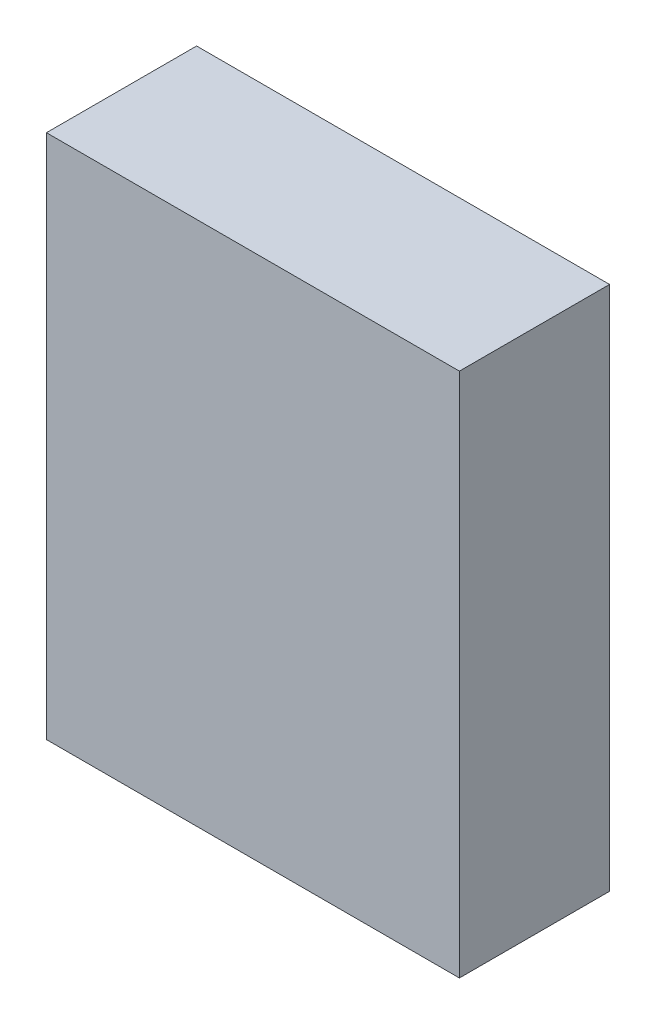
ISO-10303-21;
HEADER;
FILE_DESCRIPTION(('STEP AP214'),'2;1');
FILE_NAME('part.step','',(''),(''),'','','');
FILE_SCHEMA(('AUTOMOTIVE_DESIGN { 1 0 10303 214 1 1 1 1 }'));
ENDSEC;
DATA;
#1=APPLICATION_CONTEXT('core data for automotive mechanical design processes');
#2=APPLICATION_PROTOCOL_DEFINITION('international standard','automotive_design',2000,#1);
#3=PRODUCT_CONTEXT('',#1,'mechanical');
#4=PRODUCT('Part','Part','',(#3));
#5=PRODUCT_RELATED_PRODUCT_CATEGORY('part','',(#4));
#6=PRODUCT_DEFINITION_FORMATION('','',#4);
#7=PRODUCT_DEFINITION_CONTEXT('part definition',#1,'design');
#8=PRODUCT_DEFINITION('design','',#6,#7);
#9=PRODUCT_DEFINITION_SHAPE('','',#8);
#10=(LENGTH_UNIT() NAMED_UNIT(*) SI_UNIT(.MILLI.,.METRE.));
#11=(NAMED_UNIT(*) PLANE_ANGLE_UNIT() SI_UNIT($,.RADIAN.));
#12=(NAMED_UNIT(*) SI_UNIT($,.STERADIAN.) SOLID_ANGLE_UNIT());
#13=UNCERTAINTY_MEASURE_WITH_UNIT(LENGTH_MEASURE(1.E-05),#10,'distance_accuracy_value','');
#14=(GEOMETRIC_REPRESENTATION_CONTEXT(3) GLOBAL_UNCERTAINTY_ASSIGNED_CONTEXT((#13)) GLOBAL_UNIT_ASSIGNED_CONTEXT((#10,
#11,#12)) REPRESENTATION_CONTEXT('',''));
#15=CARTESIAN_POINT('',(0.,0.,0.));
#16=DIRECTION('',(0.,0.,1.));
#17=DIRECTION('',(1.,0.,0.));
#18=AXIS2_PLACEMENT_3D('',#15,#16,#17);
#19=CARTESIAN_POINT('',(-27.5,35.,20.));
#20=DIRECTION('',(1.,0.,0.));
#21=DIRECTION('',(0.,0.,-1.));
#22=AXIS2_PLACEMENT_3D('',#19,#20,#21);
#23=PLANE('',#22);
#24=DIRECTION('',(0.,-1.,0.));
#25=VECTOR('',#24,1.);
#26=CARTESIAN_POINT('',(-27.5,35.,0.));
#27=LINE('',#26,#25);
#28=CARTESIAN_POINT('',(-27.5,35.,0.));
#29=VERTEX_POINT('',#28);
#30=CARTESIAN_POINT('',(-27.5,-35.,0.));
#31=VERTEX_POINT('',#30);
#32=EDGE_CURVE('E96',#29,#31,#27,.T.);
#33=ORIENTED_EDGE('',*,*,#32,.T.);
#34=DIRECTION('',(0.,0.,-1.));
#35=VECTOR('',#34,1.);
#36=CARTESIAN_POINT('',(-27.5,-35.,20.));
#37=LINE('',#36,#35);
#38=CARTESIAN_POINT('',(-27.5,-35.,20.));
#39=VERTEX_POINT('',#38);
#40=EDGE_CURVE('E11',#39,#31,#37,.T.);
#41=ORIENTED_EDGE('',*,*,#40,.F.);
#42=DIRECTION('',(0.,-1.,0.));
#43=VECTOR('',#42,1.);
#44=CARTESIAN_POINT('',(-27.5,35.,20.));
#45=LINE('',#44,#43);
#46=CARTESIAN_POINT('',(-27.5,35.,20.));
#47=VERTEX_POINT('',#46);
#48=EDGE_CURVE('E84',#47,#39,#45,.T.);
#49=ORIENTED_EDGE('',*,*,#48,.F.);
#50=DIRECTION('',(0.,0.,-1.));
#51=VECTOR('',#50,1.);
#52=CARTESIAN_POINT('',(-27.5,35.,20.));
#53=LINE('',#52,#51);
#54=EDGE_CURVE('E92',#47,#29,#53,.T.);
#55=ORIENTED_EDGE('',*,*,#54,.T.);
#56=EDGE_LOOP('',(#33,#41,#49,#55));
#57=FACE_BOUND('',#56,.T.);
#58=ADVANCED_FACE('F33',(#57),#23,.F.);
#59=CARTESIAN_POINT('',(27.5,-35.,20.));
#60=DIRECTION('',(0.,1.,0.));
#61=DIRECTION('',(0.,0.,1.));
#62=AXIS2_PLACEMENT_3D('',#59,#60,#61);
#63=PLANE('',#62);
#64=DIRECTION('',(1.,0.,0.));
#65=VECTOR('',#64,1.);
#66=CARTESIAN_POINT('',(27.5,-35.,0.));
#67=LINE('',#66,#65);
#68=CARTESIAN_POINT('',(27.5,-35.,0.));
#69=VERTEX_POINT('',#68);
#70=EDGE_CURVE('E88',#31,#69,#67,.T.);
#71=ORIENTED_EDGE('',*,*,#70,.T.);
#72=DIRECTION('',(0.,0.,-1.));
#73=VECTOR('',#72,1.);
#74=CARTESIAN_POINT('',(27.5,-35.,20.));
#75=LINE('',#74,#73);
#76=CARTESIAN_POINT('',(27.5,-35.,20.));
#77=VERTEX_POINT('',#76);
#78=EDGE_CURVE('E41',#77,#69,#75,.T.);
#79=ORIENTED_EDGE('',*,*,#78,.F.);
#80=DIRECTION('',(1.,0.,0.));
#81=VECTOR('',#80,1.);
#82=CARTESIAN_POINT('',(27.5,-35.,20.));
#83=LINE('',#82,#81);
#84=EDGE_CURVE('E79',#39,#77,#83,.T.);
#85=ORIENTED_EDGE('',*,*,#84,.F.);
#86=ORIENTED_EDGE('',*,*,#40,.T.);
#87=EDGE_LOOP('',(#71,#79,#85,#86));
#88=FACE_BOUND('',#87,.T.);
#89=ADVANCED_FACE('F87',(#88),#63,.F.);
#90=CARTESIAN_POINT('',(27.5,35.,20.));
#91=DIRECTION('',(-1.,0.,0.));
#92=DIRECTION('',(0.,0.,1.));
#93=AXIS2_PLACEMENT_3D('',#90,#91,#92);
#94=PLANE('',#93);
#95=DIRECTION('',(0.,1.,0.));
#96=VECTOR('',#95,1.);
#97=CARTESIAN_POINT('',(27.5,35.,0.));
#98=LINE('',#97,#96);
#99=CARTESIAN_POINT('',(27.5,35.,0.));
#100=VERTEX_POINT('',#99);
#101=EDGE_CURVE('E66',#69,#100,#98,.T.);
#102=ORIENTED_EDGE('',*,*,#101,.T.);
#103=DIRECTION('',(0.,0.,-1.));
#104=VECTOR('',#103,1.);
#105=CARTESIAN_POINT('',(27.5,35.,20.));
#106=LINE('',#105,#104);
#107=CARTESIAN_POINT('',(27.5,35.,20.));
#108=VERTEX_POINT('',#107);
#109=EDGE_CURVE('E89',#108,#100,#106,.T.);
#110=ORIENTED_EDGE('',*,*,#109,.F.);
#111=DIRECTION('',(0.,1.,0.));
#112=VECTOR('',#111,1.);
#113=CARTESIAN_POINT('',(27.5,35.,20.));
#114=LINE('',#113,#112);
#115=EDGE_CURVE('E82',#77,#108,#114,.T.);
#116=ORIENTED_EDGE('',*,*,#115,.F.);
#117=ORIENTED_EDGE('',*,*,#78,.T.);
#118=EDGE_LOOP('',(#102,#110,#116,#117));
#119=FACE_BOUND('',#118,.T.);
#120=ADVANCED_FACE('F90',(#119),#94,.F.);
#121=CARTESIAN_POINT('',(27.5,35.,20.));
#122=DIRECTION('',(0.,-1.,0.));
#123=DIRECTION('',(0.,0.,-1.));
#124=AXIS2_PLACEMENT_3D('',#121,#122,#123);
#125=PLANE('',#124);
#126=DIRECTION('',(-1.,0.,0.));
#127=VECTOR('',#126,1.);
#128=CARTESIAN_POINT('',(27.5,35.,0.));
#129=LINE('',#128,#127);
#130=EDGE_CURVE('E72',#100,#29,#129,.T.);
#131=ORIENTED_EDGE('',*,*,#130,.T.);
#132=ORIENTED_EDGE('',*,*,#54,.F.);
#133=DIRECTION('',(-1.,0.,0.));
#134=VECTOR('',#133,1.);
#135=CARTESIAN_POINT('',(27.5,35.,20.));
#136=LINE('',#135,#134);
#137=EDGE_CURVE('E49',#108,#47,#136,.T.);
#138=ORIENTED_EDGE('',*,*,#137,.F.);
#139=ORIENTED_EDGE('',*,*,#109,.T.);
#140=EDGE_LOOP('',(#131,#132,#138,#139));
#141=FACE_BOUND('',#140,.T.);
#142=ADVANCED_FACE('F103',(#141),#125,.F.);
#143=CARTESIAN_POINT('',(0.,0.,20.));
#144=DIRECTION('',(0.,0.,-1.));
#145=DIRECTION('',(-1.,0.,0.));
#146=AXIS2_PLACEMENT_3D('',#143,#144,#145);
#147=PLANE('',#146);
#148=ORIENTED_EDGE('',*,*,#48,.T.);
#149=ORIENTED_EDGE('',*,*,#84,.T.);
#150=ORIENTED_EDGE('',*,*,#115,.T.);
#151=ORIENTED_EDGE('',*,*,#137,.T.);
#152=EDGE_LOOP('',(#148,#149,#150,#151));
#153=FACE_BOUND('',#152,.T.);
#154=ADVANCED_FACE('F80',(#153),#147,.F.);
#155=CARTESIAN_POINT('',(0.,0.,0.));
#156=DIRECTION('',(0.,0.,-1.));
#157=DIRECTION('',(-1.,0.,0.));
#158=AXIS2_PLACEMENT_3D('',#155,#156,#157);
#159=PLANE('',#158);
#160=ORIENTED_EDGE('',*,*,#32,.F.);
#161=ORIENTED_EDGE('',*,*,#130,.F.);
#162=ORIENTED_EDGE('',*,*,#101,.F.);
#163=ORIENTED_EDGE('',*,*,#70,.F.);
#164=EDGE_LOOP('',(#160,#161,#162,#163));
#165=FACE_BOUND('',#164,.T.);
#166=ADVANCED_FACE('F106',(#165),#159,.T.);
#167=CLOSED_SHELL('',(#58,#89,#120,#142,#154,#166));
#168=MANIFOLD_SOLID_BREP('B2',#167);
#169=ADVANCED_BREP_SHAPE_REPRESENTATION('',(#18,#168),#14);
#170=SHAPE_DEFINITION_REPRESENTATION(#9,#169);
ENDSEC;
END-ISO-10303-21;
